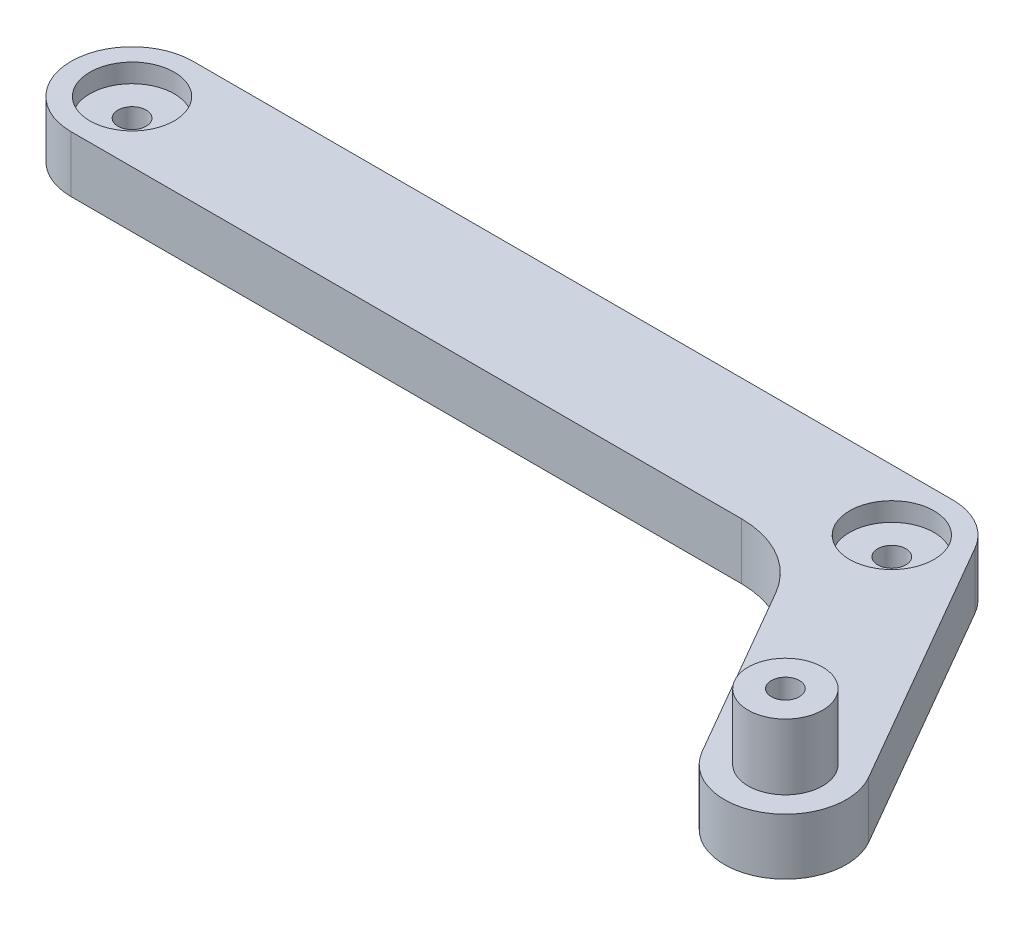
ISO-10303-21;
HEADER;
FILE_DESCRIPTION(('STEP AP214'),'2;1');
FILE_NAME('part.step','',(''),(''),'','','');
FILE_SCHEMA(('AUTOMOTIVE_DESIGN { 1 0 10303 214 1 1 1 1 }'));
ENDSEC;
DATA;
#1=APPLICATION_CONTEXT('core data for automotive mechanical design processes');
#2=APPLICATION_PROTOCOL_DEFINITION('international standard','automotive_design',2000,#1);
#3=PRODUCT_CONTEXT('',#1,'mechanical');
#4=PRODUCT('Part','Part','',(#3));
#5=PRODUCT_RELATED_PRODUCT_CATEGORY('part','',(#4));
#6=PRODUCT_DEFINITION_FORMATION('','',#4);
#7=PRODUCT_DEFINITION_CONTEXT('part definition',#1,'design');
#8=PRODUCT_DEFINITION('design','',#6,#7);
#9=PRODUCT_DEFINITION_SHAPE('','',#8);
#10=(LENGTH_UNIT() NAMED_UNIT(*) SI_UNIT(.MILLI.,.METRE.));
#11=(NAMED_UNIT(*) PLANE_ANGLE_UNIT() SI_UNIT($,.RADIAN.));
#12=(NAMED_UNIT(*) SI_UNIT($,.STERADIAN.) SOLID_ANGLE_UNIT());
#13=UNCERTAINTY_MEASURE_WITH_UNIT(LENGTH_MEASURE(1.E-05),#10,'distance_accuracy_value','');
#14=(GEOMETRIC_REPRESENTATION_CONTEXT(3) GLOBAL_UNCERTAINTY_ASSIGNED_CONTEXT((#13)) GLOBAL_UNIT_ASSIGNED_CONTEXT((#10,
#11,#12)) REPRESENTATION_CONTEXT('',''));
#15=CARTESIAN_POINT('',(0.,0.,0.));
#16=DIRECTION('',(0.,0.,1.));
#17=DIRECTION('',(1.,0.,0.));
#18=AXIS2_PLACEMENT_3D('',#15,#16,#17);
#19=CARTESIAN_POINT('',(0.,6.,0.));
#20=DIRECTION('',(0.,1.,0.));
#21=DIRECTION('',(0.,0.,1.));
#22=AXIS2_PLACEMENT_3D('',#19,#20,#21);
#23=PLANE('',#22);
#24=CARTESIAN_POINT('',(0.,6.,0.));
#25=DIRECTION('',(0.,1.,0.));
#26=DIRECTION('',(0.,0.,1.));
#27=AXIS2_PLACEMENT_3D('',#24,#25,#26);
#28=CIRCLE('',#27,6.5);
#29=CARTESIAN_POINT('',(0.,6.,-6.5));
#30=VERTEX_POINT('',#29);
#31=CARTESIAN_POINT('',(0.,6.,6.5));
#32=VERTEX_POINT('',#31);
#33=EDGE_CURVE('E170',#30,#32,#28,.T.);
#34=ORIENTED_EDGE('',*,*,#33,.T.);
#35=DIRECTION('',(1.,0.,0.));
#36=VECTOR('',#35,1.);
#37=CARTESIAN_POINT('',(0.,6.,6.5));
#38=LINE('',#37,#36);
#39=CARTESIAN_POINT('',(71.4737205583711,6.,6.49999999999999));
#40=VERTEX_POINT('',#39);
#41=EDGE_CURVE('E106',#32,#40,#38,.T.);
#42=ORIENTED_EDGE('',*,*,#41,.T.);
#43=CARTESIAN_POINT('',(71.4737205583711,6.,16.5));
#44=DIRECTION('',(0.,-1.,0.));
#45=DIRECTION('',(0.,0.,1.));
#46=AXIS2_PLACEMENT_3D('',#43,#44,#45);
#47=CIRCLE('',#46,10.);
#48=CARTESIAN_POINT('',(80.1339745962156,6.,11.5));
#49=VERTEX_POINT('',#48);
#50=EDGE_CURVE('E232',#40,#49,#47,.T.);
#51=ORIENTED_EDGE('',*,*,#50,.T.);
#52=DIRECTION('',(0.499999999999998,0.,0.86602540378444));
#53=VECTOR('',#52,1.);
#54=CARTESIAN_POINT('',(80.1339745962156,6.,11.5));
#55=LINE('',#54,#53);
#56=CARTESIAN_POINT('',(90.8708348754011,6.,30.0967875173176));
#57=VERTEX_POINT('',#56);
#58=EDGE_CURVE('E235',#49,#57,#55,.T.);
#59=ORIENTED_EDGE('',*,*,#58,.T.);
#60=CARTESIAN_POINT('',(96.4999999999999,6.,26.8467875173176));
#61=DIRECTION('',(0.,1.,0.));
#62=DIRECTION('',(0.,0.,1.));
#63=AXIS2_PLACEMENT_3D('',#60,#61,#62);
#64=CIRCLE('',#63,6.5);
#65=CARTESIAN_POINT('',(102.129165124599,6.,23.5967875173177));
#66=VERTEX_POINT('',#65);
#67=EDGE_CURVE('E125',#57,#66,#64,.T.);
#68=ORIENTED_EDGE('',*,*,#67,.T.);
#69=DIRECTION('',(-0.499999999999998,0.,-0.86602540378444));
#70=VECTOR('',#69,1.);
#71=CARTESIAN_POINT('',(86.6291651245989,6.,-3.24999999999999));
#72=LINE('',#71,#70);
#73=CARTESIAN_POINT('',(86.6291651245989,6.,-3.24999999999998));
#74=VERTEX_POINT('',#73);
#75=EDGE_CURVE('E119',#66,#74,#72,.T.);
#76=ORIENTED_EDGE('',*,*,#75,.T.);
#77=CARTESIAN_POINT('',(81.,6.,0.));
#78=DIRECTION('',(0.,1.,0.));
#79=DIRECTION('',(0.,0.,1.));
#80=AXIS2_PLACEMENT_3D('',#77,#78,#79);
#81=CIRCLE('',#80,6.5);
#82=CARTESIAN_POINT('',(81.,6.,-6.5));
#83=VERTEX_POINT('',#82);
#84=EDGE_CURVE('E123',#74,#83,#81,.T.);
#85=ORIENTED_EDGE('',*,*,#84,.T.);
#86=DIRECTION('',(-1.,0.,0.));
#87=VECTOR('',#86,1.);
#88=CARTESIAN_POINT('',(0.,6.,-6.5));
#89=LINE('',#88,#87);
#90=EDGE_CURVE('E63',#83,#30,#89,.T.);
#91=ORIENTED_EDGE('',*,*,#90,.T.);
#92=EDGE_LOOP('',(#34,#42,#51,#59,#68,#76,#85,#91));
#93=FACE_BOUND('',#92,.T.);
#94=CARTESIAN_POINT('',(0.,6.,0.));
#95=DIRECTION('',(0.,1.,0.));
#96=DIRECTION('',(0.,0.,1.));
#97=AXIS2_PLACEMENT_3D('',#94,#95,#96);
#98=CIRCLE('',#97,4.5);
#99=CARTESIAN_POINT('',(0.,6.,4.5));
#100=VERTEX_POINT('',#99);
#101=EDGE_CURVE('E204',#100,#100,#98,.T.);
#102=ORIENTED_EDGE('',*,*,#101,.F.);
#103=EDGE_LOOP('',(#102));
#104=FACE_BOUND('',#103,.T.);
#105=CARTESIAN_POINT('',(81.,6.,0.));
#106=DIRECTION('',(0.,1.,0.));
#107=DIRECTION('',(0.,0.,1.));
#108=AXIS2_PLACEMENT_3D('',#105,#106,#107);
#109=CIRCLE('',#108,4.49999999999999);
#110=CARTESIAN_POINT('',(81.,6.,4.49999999999999));
#111=VERTEX_POINT('',#110);
#112=EDGE_CURVE('E198',#111,#111,#109,.T.);
#113=ORIENTED_EDGE('',*,*,#112,.F.);
#114=EDGE_LOOP('',(#113));
#115=FACE_BOUND('',#114,.T.);
#116=CARTESIAN_POINT('',(96.4999999999999,6.,26.8467875173176));
#117=DIRECTION('',(0.,1.,0.));
#118=DIRECTION('',(0.,0.,1.));
#119=AXIS2_PLACEMENT_3D('',#116,#117,#118);
#120=CIRCLE('',#119,3.97500000000001);
#121=CARTESIAN_POINT('',(96.4999999999999,6.,30.8217875173176));
#122=VERTEX_POINT('',#121);
#123=EDGE_CURVE('E207',#122,#122,#120,.T.);
#124=ORIENTED_EDGE('',*,*,#123,.F.);
#125=EDGE_LOOP('',(#124));
#126=FACE_BOUND('',#125,.T.);
#127=ADVANCED_FACE('F43',(#93,#104,#115,#126),#23,.T.);
#128=CARTESIAN_POINT('',(0.,6.,0.));
#129=DIRECTION('',(0.,-1.,0.));
#130=DIRECTION('',(0.,0.,-1.));
#131=AXIS2_PLACEMENT_3D('',#128,#129,#130);
#132=CYLINDRICAL_SURFACE('',#131,1.5);
#133=CARTESIAN_POINT('',(0.,0.,0.));
#134=DIRECTION('',(0.,1.,0.));
#135=DIRECTION('',(0.,0.,1.));
#136=AXIS2_PLACEMENT_3D('',#133,#134,#135);
#137=CIRCLE('',#136,1.5);
#138=CARTESIAN_POINT('',(0.,0.,1.5));
#139=VERTEX_POINT('',#138);
#140=EDGE_CURVE('E152',#139,#139,#137,.T.);
#141=ORIENTED_EDGE('',*,*,#140,.F.);
#142=EDGE_LOOP('',(#141));
#143=FACE_BOUND('',#142,.T.);
#144=CARTESIAN_POINT('',(0.,4.,0.));
#145=DIRECTION('',(0.,1.,0.));
#146=DIRECTION('',(0.,0.,1.));
#147=AXIS2_PLACEMENT_3D('',#144,#145,#146);
#148=CIRCLE('',#147,1.5);
#149=CARTESIAN_POINT('',(0.,4.,1.5));
#150=VERTEX_POINT('',#149);
#151=EDGE_CURVE('E47',#150,#150,#148,.T.);
#152=ORIENTED_EDGE('',*,*,#151,.T.);
#153=EDGE_LOOP('',(#152));
#154=FACE_BOUND('',#153,.T.);
#155=ADVANCED_FACE('F270',(#143,#154),#132,.F.);
#156=CARTESIAN_POINT('',(81.,6.,0.));
#157=DIRECTION('',(0.,-1.,0.));
#158=DIRECTION('',(0.,0.,-1.));
#159=AXIS2_PLACEMENT_3D('',#156,#157,#158);
#160=CYLINDRICAL_SURFACE('',#159,1.5);
#161=CARTESIAN_POINT('',(81.,0.,0.));
#162=DIRECTION('',(0.,1.,0.));
#163=DIRECTION('',(0.,0.,1.));
#164=AXIS2_PLACEMENT_3D('',#161,#162,#163);
#165=CIRCLE('',#164,1.5);
#166=CARTESIAN_POINT('',(81.,0.,1.5));
#167=VERTEX_POINT('',#166);
#168=EDGE_CURVE('E221',#167,#167,#165,.T.);
#169=ORIENTED_EDGE('',*,*,#168,.F.);
#170=EDGE_LOOP('',(#169));
#171=FACE_BOUND('',#170,.T.);
#172=CARTESIAN_POINT('',(81.,4.,0.));
#173=DIRECTION('',(0.,1.,0.));
#174=DIRECTION('',(0.,0.,1.));
#175=AXIS2_PLACEMENT_3D('',#172,#173,#174);
#176=CIRCLE('',#175,1.5);
#177=CARTESIAN_POINT('',(81.,4.,1.5));
#178=VERTEX_POINT('',#177);
#179=EDGE_CURVE('E187',#178,#178,#176,.T.);
#180=ORIENTED_EDGE('',*,*,#179,.T.);
#181=EDGE_LOOP('',(#180));
#182=FACE_BOUND('',#181,.T.);
#183=ADVANCED_FACE('F275',(#171,#182),#160,.F.);
#184=CARTESIAN_POINT('',(0.,0.,0.));
#185=DIRECTION('',(0.,1.,0.));
#186=DIRECTION('',(0.,0.,1.));
#187=AXIS2_PLACEMENT_3D('',#184,#185,#186);
#188=PLANE('',#187);
#189=CARTESIAN_POINT('',(0.,0.,0.));
#190=DIRECTION('',(0.,1.,0.));
#191=DIRECTION('',(0.,0.,1.));
#192=AXIS2_PLACEMENT_3D('',#189,#190,#191);
#193=CIRCLE('',#192,6.5);
#194=CARTESIAN_POINT('',(0.,0.,-6.5));
#195=VERTEX_POINT('',#194);
#196=CARTESIAN_POINT('',(0.,0.,6.5));
#197=VERTEX_POINT('',#196);
#198=EDGE_CURVE('E147',#195,#197,#193,.T.);
#199=ORIENTED_EDGE('',*,*,#198,.F.);
#200=DIRECTION('',(-1.,0.,0.));
#201=VECTOR('',#200,1.);
#202=CARTESIAN_POINT('',(0.,0.,-6.5));
#203=LINE('',#202,#201);
#204=CARTESIAN_POINT('',(81.,0.,-6.5));
#205=VERTEX_POINT('',#204);
#206=EDGE_CURVE('E98',#205,#195,#203,.T.);
#207=ORIENTED_EDGE('',*,*,#206,.F.);
#208=CARTESIAN_POINT('',(81.,0.,0.));
#209=DIRECTION('',(0.,1.,0.));
#210=DIRECTION('',(0.,0.,1.));
#211=AXIS2_PLACEMENT_3D('',#208,#209,#210);
#212=CIRCLE('',#211,6.5);
#213=CARTESIAN_POINT('',(86.6291651245989,0.,-3.24999999999998));
#214=VERTEX_POINT('',#213);
#215=EDGE_CURVE('E92',#214,#205,#212,.T.);
#216=ORIENTED_EDGE('',*,*,#215,.F.);
#217=DIRECTION('',(-0.499999999999998,0.,-0.86602540378444));
#218=VECTOR('',#217,1.);
#219=CARTESIAN_POINT('',(86.6291651245989,0.,-3.24999999999999));
#220=LINE('',#219,#218);
#221=CARTESIAN_POINT('',(102.129165124599,0.,23.5967875173177));
#222=VERTEX_POINT('',#221);
#223=EDGE_CURVE('E134',#222,#214,#220,.T.);
#224=ORIENTED_EDGE('',*,*,#223,.F.);
#225=CARTESIAN_POINT('',(96.4999999999999,0.,26.8467875173176));
#226=DIRECTION('',(0.,1.,0.));
#227=DIRECTION('',(0.,0.,1.));
#228=AXIS2_PLACEMENT_3D('',#225,#226,#227);
#229=CIRCLE('',#228,6.5);
#230=CARTESIAN_POINT('',(90.8708348754011,0.,30.0967875173176));
#231=VERTEX_POINT('',#230);
#232=EDGE_CURVE('E161',#231,#222,#229,.T.);
#233=ORIENTED_EDGE('',*,*,#232,.F.);
#234=DIRECTION('',(0.499999999999998,0.,0.86602540378444));
#235=VECTOR('',#234,1.);
#236=CARTESIAN_POINT('',(80.1339745962156,0.,11.5));
#237=LINE('',#236,#235);
#238=CARTESIAN_POINT('',(80.1339745962156,0.,11.5));
#239=VERTEX_POINT('',#238);
#240=EDGE_CURVE('E158',#239,#231,#237,.T.);
#241=ORIENTED_EDGE('',*,*,#240,.F.);
#242=CARTESIAN_POINT('',(71.4737205583711,0.,16.5));
#243=DIRECTION('',(0.,-1.,0.));
#244=DIRECTION('',(0.,0.,1.));
#245=AXIS2_PLACEMENT_3D('',#242,#243,#244);
#246=CIRCLE('',#245,10.);
#247=CARTESIAN_POINT('',(71.4737205583711,0.,6.49999999999999));
#248=VERTEX_POINT('',#247);
#249=EDGE_CURVE('E155',#248,#239,#246,.T.);
#250=ORIENTED_EDGE('',*,*,#249,.F.);
#251=DIRECTION('',(1.,0.,0.));
#252=VECTOR('',#251,1.);
#253=CARTESIAN_POINT('',(0.,0.,6.5));
#254=LINE('',#253,#252);
#255=EDGE_CURVE('E151',#197,#248,#254,.T.);
#256=ORIENTED_EDGE('',*,*,#255,.F.);
#257=EDGE_LOOP('',(#199,#207,#216,#224,#233,#241,#250,#256));
#258=FACE_BOUND('',#257,.T.);
#259=ORIENTED_EDGE('',*,*,#140,.T.);
#260=EDGE_LOOP('',(#259));
#261=FACE_BOUND('',#260,.T.);
#262=ORIENTED_EDGE('',*,*,#168,.T.);
#263=EDGE_LOOP('',(#262));
#264=FACE_BOUND('',#263,.T.);
#265=CARTESIAN_POINT('',(96.4999999999999,0.,26.8467875173176));
#266=DIRECTION('',(0.,1.,0.));
#267=DIRECTION('',(0.,0.,1.));
#268=AXIS2_PLACEMENT_3D('',#265,#266,#267);
#269=CIRCLE('',#268,1.5);
#270=CARTESIAN_POINT('',(96.4999999999999,0.,28.3467875173176));
#271=VERTEX_POINT('',#270);
#272=EDGE_CURVE('E196',#271,#271,#269,.T.);
#273=ORIENTED_EDGE('',*,*,#272,.T.);
#274=EDGE_LOOP('',(#273));
#275=FACE_BOUND('',#274,.T.);
#276=ADVANCED_FACE('F250',(#258,#261,#264,#275),#188,.F.);
#277=CARTESIAN_POINT('',(0.,6.,0.));
#278=DIRECTION('',(0.,-1.,0.));
#279=DIRECTION('',(0.,0.,-1.));
#280=AXIS2_PLACEMENT_3D('',#277,#278,#279);
#281=CYLINDRICAL_SURFACE('',#280,6.5);
#282=ORIENTED_EDGE('',*,*,#198,.T.);
#283=DIRECTION('',(0.,-1.,0.));
#284=VECTOR('',#283,1.);
#285=CARTESIAN_POINT('',(0.,6.,6.5));
#286=LINE('',#285,#284);
#287=EDGE_CURVE('E11',#32,#197,#286,.T.);
#288=ORIENTED_EDGE('',*,*,#287,.F.);
#289=ORIENTED_EDGE('',*,*,#33,.F.);
#290=DIRECTION('',(0.,-1.,0.));
#291=VECTOR('',#290,1.);
#292=CARTESIAN_POINT('',(0.,6.,-6.5));
#293=LINE('',#292,#291);
#294=EDGE_CURVE('E143',#30,#195,#293,.T.);
#295=ORIENTED_EDGE('',*,*,#294,.T.);
#296=EDGE_LOOP('',(#282,#288,#289,#295));
#297=FACE_BOUND('',#296,.T.);
#298=ADVANCED_FACE('F45',(#297),#281,.T.);
#299=CARTESIAN_POINT('',(0.,6.,6.5));
#300=DIRECTION('',(0.,0.,-1.));
#301=DIRECTION('',(-1.,0.,0.));
#302=AXIS2_PLACEMENT_3D('',#299,#300,#301);
#303=PLANE('',#302);
#304=ORIENTED_EDGE('',*,*,#255,.T.);
#305=DIRECTION('',(0.,-1.,0.));
#306=VECTOR('',#305,1.);
#307=CARTESIAN_POINT('',(71.4737205583711,6.,6.49999999999999));
#308=LINE('',#307,#306);
#309=EDGE_CURVE('E54',#40,#248,#308,.T.);
#310=ORIENTED_EDGE('',*,*,#309,.F.);
#311=ORIENTED_EDGE('',*,*,#41,.F.);
#312=ORIENTED_EDGE('',*,*,#287,.T.);
#313=EDGE_LOOP('',(#304,#310,#311,#312));
#314=FACE_BOUND('',#313,.T.);
#315=ADVANCED_FACE('F284',(#314),#303,.F.);
#316=CARTESIAN_POINT('',(71.4737205583711,6.,16.5));
#317=DIRECTION('',(0.,-1.,0.));
#318=DIRECTION('',(0.,0.,-1.));
#319=AXIS2_PLACEMENT_3D('',#316,#317,#318);
#320=CYLINDRICAL_SURFACE('',#319,10.);
#321=ORIENTED_EDGE('',*,*,#249,.T.);
#322=DIRECTION('',(0.,-1.,0.));
#323=VECTOR('',#322,1.);
#324=CARTESIAN_POINT('',(80.1339745962156,6.,11.5));
#325=LINE('',#324,#323);
#326=EDGE_CURVE('E181',#49,#239,#325,.T.);
#327=ORIENTED_EDGE('',*,*,#326,.F.);
#328=ORIENTED_EDGE('',*,*,#50,.F.);
#329=ORIENTED_EDGE('',*,*,#309,.T.);
#330=EDGE_LOOP('',(#321,#327,#328,#329));
#331=FACE_BOUND('',#330,.T.);
#332=ADVANCED_FACE('F431',(#331),#320,.F.);
#333=CARTESIAN_POINT('',(80.1339745962156,6.,11.5));
#334=DIRECTION('',(0.86602540378444,0.,-0.499999999999998));
#335=DIRECTION('',(-0.499999999999998,0.,-0.86602540378444));
#336=AXIS2_PLACEMENT_3D('',#333,#334,#335);
#337=PLANE('',#336);
#338=ORIENTED_EDGE('',*,*,#240,.T.);
#339=DIRECTION('',(0.,-1.,0.));
#340=VECTOR('',#339,1.);
#341=CARTESIAN_POINT('',(90.8708348754011,6.,30.0967875173176));
#342=LINE('',#341,#340);
#343=EDGE_CURVE('E177',#57,#231,#342,.T.);
#344=ORIENTED_EDGE('',*,*,#343,.F.);
#345=ORIENTED_EDGE('',*,*,#58,.F.);
#346=ORIENTED_EDGE('',*,*,#326,.T.);
#347=EDGE_LOOP('',(#338,#344,#345,#346));
#348=FACE_BOUND('',#347,.T.);
#349=ADVANCED_FACE('F243',(#348),#337,.F.);
#350=CARTESIAN_POINT('',(96.4999999999999,6.,26.8467875173176));
#351=DIRECTION('',(0.,-1.,0.));
#352=DIRECTION('',(0.,0.,-1.));
#353=AXIS2_PLACEMENT_3D('',#350,#351,#352);
#354=CYLINDRICAL_SURFACE('',#353,6.5);
#355=ORIENTED_EDGE('',*,*,#232,.T.);
#356=DIRECTION('',(0.,-1.,0.));
#357=VECTOR('',#356,1.);
#358=CARTESIAN_POINT('',(102.129165124599,6.,23.5967875173177));
#359=LINE('',#358,#357);
#360=EDGE_CURVE('E136',#66,#222,#359,.T.);
#361=ORIENTED_EDGE('',*,*,#360,.F.);
#362=ORIENTED_EDGE('',*,*,#67,.F.);
#363=ORIENTED_EDGE('',*,*,#343,.T.);
#364=EDGE_LOOP('',(#355,#361,#362,#363));
#365=FACE_BOUND('',#364,.T.);
#366=ADVANCED_FACE('F247',(#365),#354,.T.);
#367=CARTESIAN_POINT('',(86.6291651245989,6.,-3.24999999999999));
#368=DIRECTION('',(-0.86602540378444,0.,0.499999999999998));
#369=DIRECTION('',(0.499999999999998,0.,0.86602540378444));
#370=AXIS2_PLACEMENT_3D('',#367,#368,#369);
#371=PLANE('',#370);
#372=ORIENTED_EDGE('',*,*,#223,.T.);
#373=DIRECTION('',(0.,-1.,0.));
#374=VECTOR('',#373,1.);
#375=CARTESIAN_POINT('',(86.6291651245989,6.,-3.24999999999998));
#376=LINE('',#375,#374);
#377=EDGE_CURVE('E131',#74,#214,#376,.T.);
#378=ORIENTED_EDGE('',*,*,#377,.F.);
#379=ORIENTED_EDGE('',*,*,#75,.F.);
#380=ORIENTED_EDGE('',*,*,#360,.T.);
#381=EDGE_LOOP('',(#372,#378,#379,#380));
#382=FACE_BOUND('',#381,.T.);
#383=ADVANCED_FACE('F132',(#382),#371,.F.);
#384=CARTESIAN_POINT('',(81.,6.,0.));
#385=DIRECTION('',(0.,-1.,0.));
#386=DIRECTION('',(0.,0.,-1.));
#387=AXIS2_PLACEMENT_3D('',#384,#385,#386);
#388=CYLINDRICAL_SURFACE('',#387,6.5);
#389=ORIENTED_EDGE('',*,*,#215,.T.);
#390=DIRECTION('',(0.,-1.,0.));
#391=VECTOR('',#390,1.);
#392=CARTESIAN_POINT('',(81.,6.,-6.5));
#393=LINE('',#392,#391);
#394=EDGE_CURVE('E137',#83,#205,#393,.T.);
#395=ORIENTED_EDGE('',*,*,#394,.F.);
#396=ORIENTED_EDGE('',*,*,#84,.F.);
#397=ORIENTED_EDGE('',*,*,#377,.T.);
#398=EDGE_LOOP('',(#389,#395,#396,#397));
#399=FACE_BOUND('',#398,.T.);
#400=ADVANCED_FACE('F139',(#399),#388,.T.);
#401=CARTESIAN_POINT('',(0.,6.,-6.5));
#402=DIRECTION('',(0.,0.,1.));
#403=DIRECTION('',(1.,0.,0.));
#404=AXIS2_PLACEMENT_3D('',#401,#402,#403);
#405=PLANE('',#404);
#406=ORIENTED_EDGE('',*,*,#206,.T.);
#407=ORIENTED_EDGE('',*,*,#294,.F.);
#408=ORIENTED_EDGE('',*,*,#90,.F.);
#409=ORIENTED_EDGE('',*,*,#394,.T.);
#410=EDGE_LOOP('',(#406,#407,#408,#409));
#411=FACE_BOUND('',#410,.T.);
#412=ADVANCED_FACE('F256',(#411),#405,.F.);
#413=CARTESIAN_POINT('',(96.4999999999999,6.,26.8467875173176));
#414=DIRECTION('',(0.,-1.,0.));
#415=DIRECTION('',(0.,0.,-1.));
#416=AXIS2_PLACEMENT_3D('',#413,#414,#415);
#417=CYLINDRICAL_SURFACE('',#416,1.5);
#418=ORIENTED_EDGE('',*,*,#272,.F.);
#419=EDGE_LOOP('',(#418));
#420=FACE_BOUND('',#419,.T.);
#421=CARTESIAN_POINT('',(96.4999999999999,13.,26.8467875173176));
#422=DIRECTION('',(0.,1.,0.));
#423=DIRECTION('',(0.,0.,1.));
#424=AXIS2_PLACEMENT_3D('',#421,#422,#423);
#425=CIRCLE('',#424,1.5);
#426=CARTESIAN_POINT('',(96.4999999999999,13.,28.3467875173176));
#427=VERTEX_POINT('',#426);
#428=EDGE_CURVE('E319',#427,#427,#425,.T.);
#429=ORIENTED_EDGE('',*,*,#428,.T.);
#430=EDGE_LOOP('',(#429));
#431=FACE_BOUND('',#430,.T.);
#432=ADVANCED_FACE('F258',(#420,#431),#417,.F.);
#433=CARTESIAN_POINT('',(81.,4.,0.));
#434=DIRECTION('',(0.,1.,0.));
#435=DIRECTION('',(0.,0.,1.));
#436=AXIS2_PLACEMENT_3D('',#433,#434,#435);
#437=CYLINDRICAL_SURFACE('',#436,4.49999999999999);
#438=CARTESIAN_POINT('',(81.,4.,0.));
#439=DIRECTION('',(0.,1.,0.));
#440=DIRECTION('',(0.,0.,1.));
#441=AXIS2_PLACEMENT_3D('',#438,#439,#440);
#442=CIRCLE('',#441,4.49999999999999);
#443=CARTESIAN_POINT('',(81.,4.,4.49999999999999));
#444=VERTEX_POINT('',#443);
#445=EDGE_CURVE('E190',#444,#444,#442,.T.);
#446=ORIENTED_EDGE('',*,*,#445,.F.);
#447=EDGE_LOOP('',(#446));
#448=FACE_BOUND('',#447,.T.);
#449=ORIENTED_EDGE('',*,*,#112,.T.);
#450=EDGE_LOOP('',(#449));
#451=FACE_BOUND('',#450,.T.);
#452=ADVANCED_FACE('F264',(#448,#451),#437,.F.);
#453=CARTESIAN_POINT('',(81.,4.,0.));
#454=DIRECTION('',(0.,1.,0.));
#455=DIRECTION('',(0.,0.,1.));
#456=AXIS2_PLACEMENT_3D('',#453,#454,#455);
#457=PLANE('',#456);
#458=ORIENTED_EDGE('',*,*,#179,.F.);
#459=EDGE_LOOP('',(#458));
#460=FACE_BOUND('',#459,.T.);
#461=ORIENTED_EDGE('',*,*,#445,.T.);
#462=EDGE_LOOP('',(#461));
#463=FACE_BOUND('',#462,.T.);
#464=ADVANCED_FACE('F298',(#460,#463),#457,.T.);
#465=CARTESIAN_POINT('',(0.,4.,0.));
#466=DIRECTION('',(0.,1.,0.));
#467=DIRECTION('',(0.,0.,1.));
#468=AXIS2_PLACEMENT_3D('',#465,#466,#467);
#469=CYLINDRICAL_SURFACE('',#468,4.5);
#470=CARTESIAN_POINT('',(0.,4.,0.));
#471=DIRECTION('',(0.,1.,0.));
#472=DIRECTION('',(0.,0.,1.));
#473=AXIS2_PLACEMENT_3D('',#470,#471,#472);
#474=CIRCLE('',#473,4.5);
#475=CARTESIAN_POINT('',(0.,4.,4.5));
#476=VERTEX_POINT('',#475);
#477=EDGE_CURVE('E213',#476,#476,#474,.T.);
#478=ORIENTED_EDGE('',*,*,#477,.F.);
#479=EDGE_LOOP('',(#478));
#480=FACE_BOUND('',#479,.T.);
#481=ORIENTED_EDGE('',*,*,#101,.T.);
#482=EDGE_LOOP('',(#481));
#483=FACE_BOUND('',#482,.T.);
#484=ADVANCED_FACE('F294',(#480,#483),#469,.F.);
#485=CARTESIAN_POINT('',(0.,4.,0.));
#486=DIRECTION('',(0.,1.,0.));
#487=DIRECTION('',(0.,0.,1.));
#488=AXIS2_PLACEMENT_3D('',#485,#486,#487);
#489=PLANE('',#488);
#490=ORIENTED_EDGE('',*,*,#151,.F.);
#491=EDGE_LOOP('',(#490));
#492=FACE_BOUND('',#491,.T.);
#493=ORIENTED_EDGE('',*,*,#477,.T.);
#494=EDGE_LOOP('',(#493));
#495=FACE_BOUND('',#494,.T.);
#496=ADVANCED_FACE('F290',(#492,#495),#489,.T.);
#497=CARTESIAN_POINT('',(96.4999999999999,13.,26.8467875173176));
#498=DIRECTION('',(0.,1.,0.));
#499=DIRECTION('',(0.,0.,1.));
#500=AXIS2_PLACEMENT_3D('',#497,#498,#499);
#501=PLANE('',#500);
#502=CARTESIAN_POINT('',(96.4999999999999,13.,26.8467875173176));
#503=DIRECTION('',(0.,1.,0.));
#504=DIRECTION('',(0.,0.,1.));
#505=AXIS2_PLACEMENT_3D('',#502,#503,#504);
#506=CIRCLE('',#505,3.97500000000001);
#507=CARTESIAN_POINT('',(96.4999999999999,13.,30.8217875173176));
#508=VERTEX_POINT('',#507);
#509=EDGE_CURVE('E217',#508,#508,#506,.T.);
#510=ORIENTED_EDGE('',*,*,#509,.T.);
#511=EDGE_LOOP('',(#510));
#512=FACE_BOUND('',#511,.T.);
#513=ORIENTED_EDGE('',*,*,#428,.F.);
#514=EDGE_LOOP('',(#513));
#515=FACE_BOUND('',#514,.T.);
#516=ADVANCED_FACE('F293',(#512,#515),#501,.T.);
#517=CARTESIAN_POINT('',(96.4999999999999,13.,26.8467875173176));
#518=DIRECTION('',(0.,-1.,0.));
#519=DIRECTION('',(0.,0.,-1.));
#520=AXIS2_PLACEMENT_3D('',#517,#518,#519);
#521=CYLINDRICAL_SURFACE('',#520,3.97500000000001);
#522=ORIENTED_EDGE('',*,*,#509,.F.);
#523=EDGE_LOOP('',(#522));
#524=FACE_BOUND('',#523,.T.);
#525=ORIENTED_EDGE('',*,*,#123,.T.);
#526=EDGE_LOOP('',(#525));
#527=FACE_BOUND('',#526,.T.);
#528=ADVANCED_FACE('F306',(#524,#527),#521,.T.);
#529=CLOSED_SHELL('',(#127,#155,#183,#276,#298,#315,#332,#349,#366,#383,#400,#412,#432,#452,
#464,#484,#496,#516,#528));
#530=MANIFOLD_SOLID_BREP('B2',#529);
#531=ADVANCED_BREP_SHAPE_REPRESENTATION('',(#18,#530),#14);
#532=SHAPE_DEFINITION_REPRESENTATION(#9,#531);
ENDSEC;
END-ISO-10303-21;
